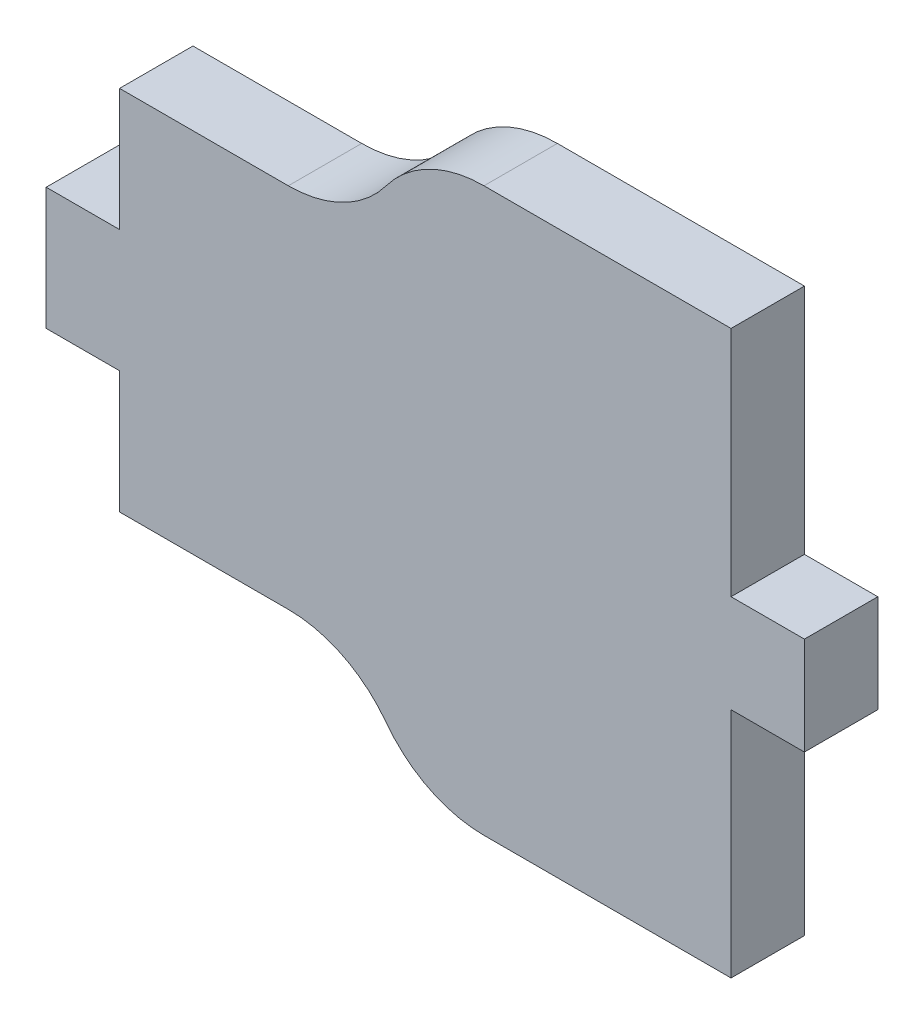
ISO-10303-21;
HEADER;
FILE_DESCRIPTION(('STEP AP214'),'2;1');
FILE_NAME('part.step','',(''),(''),'','','');
FILE_SCHEMA(('AUTOMOTIVE_DESIGN { 1 0 10303 214 1 1 1 1 }'));
ENDSEC;
DATA;
#1=APPLICATION_CONTEXT('core data for automotive mechanical design processes');
#2=APPLICATION_PROTOCOL_DEFINITION('international standard','automotive_design',2000,#1);
#3=PRODUCT_CONTEXT('',#1,'mechanical');
#4=PRODUCT('Part','Part','',(#3));
#5=PRODUCT_RELATED_PRODUCT_CATEGORY('part','',(#4));
#6=PRODUCT_DEFINITION_FORMATION('','',#4);
#7=PRODUCT_DEFINITION_CONTEXT('part definition',#1,'design');
#8=PRODUCT_DEFINITION('design','',#6,#7);
#9=PRODUCT_DEFINITION_SHAPE('','',#8);
#10=(LENGTH_UNIT() NAMED_UNIT(*) SI_UNIT(.MILLI.,.METRE.));
#11=(NAMED_UNIT(*) PLANE_ANGLE_UNIT() SI_UNIT($,.RADIAN.));
#12=(NAMED_UNIT(*) SI_UNIT($,.STERADIAN.) SOLID_ANGLE_UNIT());
#13=UNCERTAINTY_MEASURE_WITH_UNIT(LENGTH_MEASURE(1.E-05),#10,'distance_accuracy_value','');
#14=(GEOMETRIC_REPRESENTATION_CONTEXT(3) GLOBAL_UNCERTAINTY_ASSIGNED_CONTEXT((#13)) GLOBAL_UNIT_ASSIGNED_CONTEXT((#10,
#11,#12)) REPRESENTATION_CONTEXT('',''));
#15=CARTESIAN_POINT('',(0.,0.,0.));
#16=DIRECTION('',(0.,0.,1.));
#17=DIRECTION('',(1.,0.,0.));
#18=AXIS2_PLACEMENT_3D('',#15,#16,#17);
#19=CARTESIAN_POINT('',(27.7329421395879,18.0666881044929,6.));
#20=DIRECTION('',(-1.,0.,0.));
#21=DIRECTION('',(0.,-1.,0.));
#22=AXIS2_PLACEMENT_3D('',#19,#20,#21);
#23=PLANE('',#22);
#24=DIRECTION('',(0.,0.,1.));
#25=VECTOR('',#24,1.);
#26=CARTESIAN_POINT('',(27.7329421395879,7.06668810449294,0.));
#27=LINE('',#26,#25);
#28=CARTESIAN_POINT('',(27.7329421395879,7.06668810449294,0.));
#29=VERTEX_POINT('',#28);
#30=CARTESIAN_POINT('',(27.7329421395879,7.06668810449294,6.));
#31=VERTEX_POINT('',#30);
#32=EDGE_CURVE('E513',#29,#31,#27,.T.);
#33=ORIENTED_EDGE('',*,*,#32,.F.);
#34=DIRECTION('',(0.,1.,0.));
#35=VECTOR('',#34,1.);
#36=CARTESIAN_POINT('',(27.7329421395879,18.0666881044929,0.));
#37=LINE('',#36,#35);
#38=CARTESIAN_POINT('',(27.7329421395879,26.0666881044929,0.));
#39=VERTEX_POINT('',#38);
#40=EDGE_CURVE('E184',#29,#39,#37,.T.);
#41=ORIENTED_EDGE('',*,*,#40,.T.);
#42=DIRECTION('',(0.,0.,1.));
#43=VECTOR('',#42,1.);
#44=CARTESIAN_POINT('',(27.7329421395879,26.0666881044929,0.));
#45=LINE('',#44,#43);
#46=CARTESIAN_POINT('',(27.7329421395879,26.0666881044929,6.));
#47=VERTEX_POINT('',#46);
#48=EDGE_CURVE('E271',#39,#47,#45,.T.);
#49=ORIENTED_EDGE('',*,*,#48,.T.);
#50=DIRECTION('',(0.,1.,0.));
#51=VECTOR('',#50,1.);
#52=CARTESIAN_POINT('',(27.7329421395879,18.0666881044929,6.));
#53=LINE('',#52,#51);
#54=EDGE_CURVE('E265',#31,#47,#53,.T.);
#55=ORIENTED_EDGE('',*,*,#54,.F.);
#56=EDGE_LOOP('',(#33,#41,#49,#55));
#57=FACE_BOUND('',#56,.T.);
#58=ADVANCED_FACE('F33',(#57),#23,.F.);
#59=CARTESIAN_POINT('',(-22.2670578604121,18.0666881044929,6.));
#60=DIRECTION('',(1.,0.,0.));
#61=DIRECTION('',(0.,1.,0.));
#62=AXIS2_PLACEMENT_3D('',#59,#60,#61);
#63=PLANE('',#62);
#64=DIRECTION('',(0.,0.,1.));
#65=VECTOR('',#64,1.);
#66=CARTESIAN_POINT('',(-22.2670578604121,-1.93331189550706,0.));
#67=LINE('',#66,#65);
#68=CARTESIAN_POINT('',(-22.2670578604121,-1.93331189550706,0.));
#69=VERTEX_POINT('',#68);
#70=CARTESIAN_POINT('',(-22.2670578604121,-1.93331189550706,6.));
#71=VERTEX_POINT('',#70);
#72=EDGE_CURVE('E324',#69,#71,#67,.T.);
#73=ORIENTED_EDGE('',*,*,#72,.F.);
#74=DIRECTION('',(0.,-1.,0.));
#75=VECTOR('',#74,1.);
#76=CARTESIAN_POINT('',(-22.2670578604121,18.0666881044929,0.));
#77=LINE('',#76,#75);
#78=CARTESIAN_POINT('',(-22.2670578604121,-11.9333118955071,0.));
#79=VERTEX_POINT('',#78);
#80=EDGE_CURVE('E222',#69,#79,#77,.T.);
#81=ORIENTED_EDGE('',*,*,#80,.T.);
#82=DIRECTION('',(0.,0.,-1.));
#83=VECTOR('',#82,1.);
#84=CARTESIAN_POINT('',(-22.2670578604121,-11.9333118955071,6.));
#85=LINE('',#84,#83);
#86=CARTESIAN_POINT('',(-22.2670578604121,-11.9333118955071,6.));
#87=VERTEX_POINT('',#86);
#88=EDGE_CURVE('E258',#87,#79,#85,.T.);
#89=ORIENTED_EDGE('',*,*,#88,.F.);
#90=DIRECTION('',(0.,-1.,0.));
#91=VECTOR('',#90,1.);
#92=CARTESIAN_POINT('',(-22.2670578604121,18.0666881044929,6.));
#93=LINE('',#92,#91);
#94=EDGE_CURVE('E186',#71,#87,#93,.T.);
#95=ORIENTED_EDGE('',*,*,#94,.F.);
#96=EDGE_LOOP('',(#73,#81,#89,#95));
#97=FACE_BOUND('',#96,.T.);
#98=ADVANCED_FACE('F294',(#97),#63,.F.);
#99=CARTESIAN_POINT('',(-22.2670578604121,18.0666881044929,6.));
#100=DIRECTION('',(0.,-1.,0.));
#101=DIRECTION('',(0.,0.,-1.));
#102=AXIS2_PLACEMENT_3D('',#99,#100,#101);
#103=PLANE('',#102);
#104=DIRECTION('',(-1.,0.,0.));
#105=VECTOR('',#104,1.);
#106=CARTESIAN_POINT('',(-22.2670578604121,18.0666881044929,6.));
#107=LINE('',#106,#105);
#108=CARTESIAN_POINT('',(-8.46909888927936,18.0666881044929,6.));
#109=VERTEX_POINT('',#108);
#110=CARTESIAN_POINT('',(-22.2670578604121,18.0666881044929,6.));
#111=VERTEX_POINT('',#110);
#112=EDGE_CURVE('E209',#109,#111,#107,.T.);
#113=ORIENTED_EDGE('',*,*,#112,.F.);
#114=DIRECTION('',(0.,0.,1.));
#115=VECTOR('',#114,1.);
#116=CARTESIAN_POINT('',(-8.46909888927936,18.0666881044929,6.));
#117=LINE('',#116,#115);
#118=CARTESIAN_POINT('',(-8.46909888927936,18.0666881044929,0.));
#119=VERTEX_POINT('',#118);
#120=EDGE_CURVE('E213',#109,#119,#117,.F.);
#121=ORIENTED_EDGE('',*,*,#120,.T.);
#122=DIRECTION('',(-1.,0.,0.));
#123=VECTOR('',#122,1.);
#124=CARTESIAN_POINT('',(-22.2670578604121,18.0666881044929,0.));
#125=LINE('',#124,#123);
#126=CARTESIAN_POINT('',(-22.2670578604121,18.0666881044929,0.));
#127=VERTEX_POINT('',#126);
#128=EDGE_CURVE('E183',#119,#127,#125,.T.);
#129=ORIENTED_EDGE('',*,*,#128,.T.);
#130=DIRECTION('',(0.,0.,-1.));
#131=VECTOR('',#130,1.);
#132=CARTESIAN_POINT('',(-22.2670578604121,18.0666881044929,6.));
#133=LINE('',#132,#131);
#134=EDGE_CURVE('E203',#111,#127,#133,.T.);
#135=ORIENTED_EDGE('',*,*,#134,.F.);
#136=EDGE_LOOP('',(#113,#121,#129,#135));
#137=FACE_BOUND('',#136,.T.);
#138=ADVANCED_FACE('F376',(#137),#103,.F.);
#139=CARTESIAN_POINT('',(-22.2670578604121,8.06668810449294,0.));
#140=VERTEX_POINT('',#139);
#141=EDGE_CURVE('E225',#127,#140,#77,.T.);
#142=ORIENTED_EDGE('',*,*,#141,.T.);
#143=DIRECTION('',(0.,0.,1.));
#144=VECTOR('',#143,1.);
#145=CARTESIAN_POINT('',(-22.2670578604121,8.06668810449294,0.));
#146=LINE('',#145,#144);
#147=CARTESIAN_POINT('',(-22.2670578604121,8.06668810449294,6.));
#148=VERTEX_POINT('',#147);
#149=EDGE_CURVE('E319',#140,#148,#146,.T.);
#150=ORIENTED_EDGE('',*,*,#149,.T.);
#151=EDGE_CURVE('E266',#111,#148,#93,.T.);
#152=ORIENTED_EDGE('',*,*,#151,.F.);
#153=ORIENTED_EDGE('',*,*,#134,.T.);
#154=EDGE_LOOP('',(#142,#150,#152,#153));
#155=FACE_BOUND('',#154,.T.);
#156=ADVANCED_FACE('F301',(#155),#63,.F.);
#157=CARTESIAN_POINT('',(-22.2670578604121,-11.9333118955071,6.));
#158=DIRECTION('',(0.,1.,0.));
#159=DIRECTION('',(0.,0.,1.));
#160=AXIS2_PLACEMENT_3D('',#157,#158,#159);
#161=PLANE('',#160);
#162=DIRECTION('',(1.,0.,0.));
#163=VECTOR('',#162,1.);
#164=CARTESIAN_POINT('',(-22.2670578604121,-11.9333118955071,0.));
#165=LINE('',#164,#163);
#166=CARTESIAN_POINT('',(-8.46909888927935,-11.9333118955071,0.));
#167=VERTEX_POINT('',#166);
#168=EDGE_CURVE('E188',#79,#167,#165,.T.);
#169=ORIENTED_EDGE('',*,*,#168,.T.);
#170=DIRECTION('',(0.,0.,-1.));
#171=VECTOR('',#170,1.);
#172=CARTESIAN_POINT('',(-8.46909888927935,-11.9333118955071,6.));
#173=LINE('',#172,#171);
#174=CARTESIAN_POINT('',(-8.46909888927935,-11.9333118955071,6.));
#175=VERTEX_POINT('',#174);
#176=EDGE_CURVE('E231',#167,#175,#173,.F.);
#177=ORIENTED_EDGE('',*,*,#176,.T.);
#178=DIRECTION('',(1.,0.,0.));
#179=VECTOR('',#178,1.);
#180=CARTESIAN_POINT('',(-22.2670578604121,-11.9333118955071,6.));
#181=LINE('',#180,#179);
#182=EDGE_CURVE('E262',#87,#175,#181,.T.);
#183=ORIENTED_EDGE('',*,*,#182,.F.);
#184=ORIENTED_EDGE('',*,*,#88,.T.);
#185=EDGE_LOOP('',(#169,#177,#183,#184));
#186=FACE_BOUND('',#185,.T.);
#187=ADVANCED_FACE('F292',(#186),#161,.F.);
#188=CARTESIAN_POINT('',(27.7329421395879,-19.9333118955071,0.));
#189=VERTEX_POINT('',#188);
#190=CARTESIAN_POINT('',(27.7329421395879,-0.933311895507053,0.));
#191=VERTEX_POINT('',#190);
#192=EDGE_CURVE('E173',#189,#191,#37,.T.);
#193=ORIENTED_EDGE('',*,*,#192,.T.);
#194=DIRECTION('',(0.,0.,1.));
#195=VECTOR('',#194,1.);
#196=CARTESIAN_POINT('',(27.7329421395879,-0.933311895507053,0.));
#197=LINE('',#196,#195);
#198=CARTESIAN_POINT('',(27.7329421395879,-0.933311895507053,6.));
#199=VERTEX_POINT('',#198);
#200=EDGE_CURVE('E157',#191,#199,#197,.T.);
#201=ORIENTED_EDGE('',*,*,#200,.T.);
#202=CARTESIAN_POINT('',(27.7329421395879,-19.9333118955071,6.));
#203=VERTEX_POINT('',#202);
#204=EDGE_CURVE('E212',#203,#199,#53,.T.);
#205=ORIENTED_EDGE('',*,*,#204,.F.);
#206=DIRECTION('',(0.,0.,1.));
#207=VECTOR('',#206,1.);
#208=CARTESIAN_POINT('',(27.7329421395879,-19.9333118955071,0.));
#209=LINE('',#208,#207);
#210=EDGE_CURVE('E182',#189,#203,#209,.T.);
#211=ORIENTED_EDGE('',*,*,#210,.F.);
#212=EDGE_LOOP('',(#193,#201,#205,#211));
#213=FACE_BOUND('',#212,.T.);
#214=ADVANCED_FACE('F180',(#213),#23,.F.);
#215=CARTESIAN_POINT('',(0.,0.,6.));
#216=DIRECTION('',(0.,0.,1.));
#217=DIRECTION('',(1.,0.,0.));
#218=AXIS2_PLACEMENT_3D('',#215,#216,#217);
#219=PLANE('',#218);
#220=ORIENTED_EDGE('',*,*,#182,.T.);
#221=CARTESIAN_POINT('',(-8.46909888927935,-21.9333118955071,6.));
#222=DIRECTION('',(0.,0.,1.));
#223=DIRECTION('',(1.,0.,0.));
#224=AXIS2_PLACEMENT_3D('',#221,#222,#223);
#225=CIRCLE('',#224,10.);
#226=CARTESIAN_POINT('',(-0.469098889279351,-15.9333118955071,6.));
#227=VERTEX_POINT('',#226);
#228=EDGE_CURVE('E42',#175,#227,#225,.F.);
#229=ORIENTED_EDGE('',*,*,#228,.T.);
#230=CARTESIAN_POINT('',(7.53090111072065,-9.93331189550705,6.));
#231=DIRECTION('',(0.,0.,1.));
#232=DIRECTION('',(1.,0.,0.));
#233=AXIS2_PLACEMENT_3D('',#230,#231,#232);
#234=CIRCLE('',#233,10.);
#235=CARTESIAN_POINT('',(7.53090111072065,-19.9333118955071,6.));
#236=VERTEX_POINT('',#235);
#237=EDGE_CURVE('E232',#227,#236,#234,.T.);
#238=ORIENTED_EDGE('',*,*,#237,.T.);
#239=DIRECTION('',(1.,0.,0.));
#240=VECTOR('',#239,1.);
#241=CARTESIAN_POINT('',(-2.26705786041206,-19.9333118955071,6.));
#242=LINE('',#241,#240);
#243=EDGE_CURVE('E327',#236,#203,#242,.T.);
#244=ORIENTED_EDGE('',*,*,#243,.T.);
#245=ORIENTED_EDGE('',*,*,#204,.T.);
#246=DIRECTION('',(1.,0.,0.));
#247=VECTOR('',#246,1.);
#248=CARTESIAN_POINT('',(27.7329421395879,-0.933311895507053,6.));
#249=LINE('',#248,#247);
#250=CARTESIAN_POINT('',(33.7329421395879,-0.933311895507053,6.));
#251=VERTEX_POINT('',#250);
#252=EDGE_CURVE('E50',#199,#251,#249,.T.);
#253=ORIENTED_EDGE('',*,*,#252,.T.);
#254=DIRECTION('',(0.,1.,0.));
#255=VECTOR('',#254,1.);
#256=CARTESIAN_POINT('',(33.7329421395879,7.06668810449294,6.));
#257=LINE('',#256,#255);
#258=CARTESIAN_POINT('',(33.7329421395879,7.06668810449294,6.));
#259=VERTEX_POINT('',#258);
#260=EDGE_CURVE('E499',#251,#259,#257,.T.);
#261=ORIENTED_EDGE('',*,*,#260,.T.);
#262=DIRECTION('',(-1.,0.,0.));
#263=VECTOR('',#262,1.);
#264=CARTESIAN_POINT('',(27.7329421395879,7.06668810449294,6.));
#265=LINE('',#264,#263);
#266=EDGE_CURVE('E178',#259,#31,#265,.T.);
#267=ORIENTED_EDGE('',*,*,#266,.T.);
#268=ORIENTED_EDGE('',*,*,#54,.T.);
#269=DIRECTION('',(-1.,0.,0.));
#270=VECTOR('',#269,1.);
#271=CARTESIAN_POINT('',(-2.26705786041207,26.0666881044929,6.));
#272=LINE('',#271,#270);
#273=CARTESIAN_POINT('',(7.53090111072065,26.0666881044929,6.));
#274=VERTEX_POINT('',#273);
#275=EDGE_CURVE('E341',#47,#274,#272,.T.);
#276=ORIENTED_EDGE('',*,*,#275,.T.);
#277=CARTESIAN_POINT('',(7.53090111072065,16.0666881044929,6.));
#278=DIRECTION('',(0.,0.,1.));
#279=DIRECTION('',(1.,0.,0.));
#280=AXIS2_PLACEMENT_3D('',#277,#278,#279);
#281=CIRCLE('',#280,10.);
#282=CARTESIAN_POINT('',(-0.469098889279354,22.0666881044929,6.));
#283=VERTEX_POINT('',#282);
#284=EDGE_CURVE('E248',#274,#283,#281,.T.);
#285=ORIENTED_EDGE('',*,*,#284,.T.);
#286=CARTESIAN_POINT('',(-8.46909888927936,28.0666881044929,6.));
#287=DIRECTION('',(0.,0.,1.));
#288=DIRECTION('',(1.,0.,0.));
#289=AXIS2_PLACEMENT_3D('',#286,#287,#288);
#290=CIRCLE('',#289,10.);
#291=EDGE_CURVE('E356',#283,#109,#290,.F.);
#292=ORIENTED_EDGE('',*,*,#291,.T.);
#293=ORIENTED_EDGE('',*,*,#112,.T.);
#294=ORIENTED_EDGE('',*,*,#151,.T.);
#295=DIRECTION('',(-1.,0.,0.));
#296=VECTOR('',#295,1.);
#297=CARTESIAN_POINT('',(-22.2670578604121,8.06668810449294,6.));
#298=LINE('',#297,#296);
#299=CARTESIAN_POINT('',(-28.2670578604121,8.06668810449294,6.));
#300=VERTEX_POINT('',#299);
#301=EDGE_CURVE('E58',#148,#300,#298,.T.);
#302=ORIENTED_EDGE('',*,*,#301,.T.);
#303=DIRECTION('',(0.,-1.,0.));
#304=VECTOR('',#303,1.);
#305=CARTESIAN_POINT('',(-28.2670578604121,8.06668810449294,6.));
#306=LINE('',#305,#304);
#307=CARTESIAN_POINT('',(-28.2670578604121,-1.93331189550706,6.));
#308=VERTEX_POINT('',#307);
#309=EDGE_CURVE('E316',#300,#308,#306,.T.);
#310=ORIENTED_EDGE('',*,*,#309,.T.);
#311=DIRECTION('',(1.,0.,0.));
#312=VECTOR('',#311,1.);
#313=CARTESIAN_POINT('',(-22.2670578604121,-1.93331189550706,6.));
#314=LINE('',#313,#312);
#315=EDGE_CURVE('E284',#308,#71,#314,.T.);
#316=ORIENTED_EDGE('',*,*,#315,.T.);
#317=ORIENTED_EDGE('',*,*,#94,.T.);
#318=EDGE_LOOP('',(#220,#229,#238,#244,#245,#253,#261,#267,#268,#276,#285,#292,#293,#294,#302,
#310,#316,#317));
#319=FACE_BOUND('',#318,.T.);
#320=ADVANCED_FACE('F281',(#319),#219,.T.);
#321=CARTESIAN_POINT('',(0.,0.,0.));
#322=DIRECTION('',(0.,0.,1.));
#323=DIRECTION('',(1.,0.,0.));
#324=AXIS2_PLACEMENT_3D('',#321,#322,#323);
#325=PLANE('',#324);
#326=DIRECTION('',(1.,0.,0.));
#327=VECTOR('',#326,1.);
#328=CARTESIAN_POINT('',(-2.26705786041206,-19.9333118955071,0.));
#329=LINE('',#328,#327);
#330=CARTESIAN_POINT('',(7.53090111072065,-19.9333118955071,0.));
#331=VERTEX_POINT('',#330);
#332=EDGE_CURVE('E337',#331,#189,#329,.T.);
#333=ORIENTED_EDGE('',*,*,#332,.F.);
#334=CARTESIAN_POINT('',(7.53090111072065,-9.93331189550705,0.));
#335=DIRECTION('',(0.,0.,1.));
#336=DIRECTION('',(1.,0.,0.));
#337=AXIS2_PLACEMENT_3D('',#334,#335,#336);
#338=CIRCLE('',#337,10.);
#339=CARTESIAN_POINT('',(-0.469098889279351,-15.9333118955071,0.));
#340=VERTEX_POINT('',#339);
#341=EDGE_CURVE('E244',#331,#340,#338,.F.);
#342=ORIENTED_EDGE('',*,*,#341,.T.);
#343=CARTESIAN_POINT('',(-8.46909888927935,-21.9333118955071,0.));
#344=DIRECTION('',(0.,0.,1.));
#345=DIRECTION('',(1.,0.,0.));
#346=AXIS2_PLACEMENT_3D('',#343,#344,#345);
#347=CIRCLE('',#346,10.);
#348=EDGE_CURVE('E11',#340,#167,#347,.T.);
#349=ORIENTED_EDGE('',*,*,#348,.T.);
#350=ORIENTED_EDGE('',*,*,#168,.F.);
#351=ORIENTED_EDGE('',*,*,#80,.F.);
#352=DIRECTION('',(1.,0.,0.));
#353=VECTOR('',#352,1.);
#354=CARTESIAN_POINT('',(-22.2670578604121,-1.93331189550706,0.));
#355=LINE('',#354,#353);
#356=CARTESIAN_POINT('',(-28.2670578604121,-1.93331189550706,0.));
#357=VERTEX_POINT('',#356);
#358=EDGE_CURVE('E314',#357,#69,#355,.T.);
#359=ORIENTED_EDGE('',*,*,#358,.F.);
#360=DIRECTION('',(0.,-1.,0.));
#361=VECTOR('',#360,1.);
#362=CARTESIAN_POINT('',(-28.2670578604121,8.06668810449294,0.));
#363=LINE('',#362,#361);
#364=CARTESIAN_POINT('',(-28.2670578604121,8.06668810449294,0.));
#365=VERTEX_POINT('',#364);
#366=EDGE_CURVE('E312',#365,#357,#363,.T.);
#367=ORIENTED_EDGE('',*,*,#366,.F.);
#368=DIRECTION('',(-1.,0.,0.));
#369=VECTOR('',#368,1.);
#370=CARTESIAN_POINT('',(-22.2670578604121,8.06668810449294,0.));
#371=LINE('',#370,#369);
#372=EDGE_CURVE('E309',#140,#365,#371,.T.);
#373=ORIENTED_EDGE('',*,*,#372,.F.);
#374=ORIENTED_EDGE('',*,*,#141,.F.);
#375=ORIENTED_EDGE('',*,*,#128,.F.);
#376=CARTESIAN_POINT('',(-8.46909888927936,28.0666881044929,0.));
#377=DIRECTION('',(0.,0.,1.));
#378=DIRECTION('',(1.,0.,0.));
#379=AXIS2_PLACEMENT_3D('',#376,#377,#378);
#380=CIRCLE('',#379,10.);
#381=CARTESIAN_POINT('',(-0.469098889279354,22.0666881044929,0.));
#382=VERTEX_POINT('',#381);
#383=EDGE_CURVE('E358',#119,#382,#380,.T.);
#384=ORIENTED_EDGE('',*,*,#383,.T.);
#385=CARTESIAN_POINT('',(7.53090111072065,16.0666881044929,0.));
#386=DIRECTION('',(0.,0.,1.));
#387=DIRECTION('',(1.,0.,0.));
#388=AXIS2_PLACEMENT_3D('',#385,#386,#387);
#389=CIRCLE('',#388,10.);
#390=CARTESIAN_POINT('',(7.53090111072065,26.0666881044929,0.));
#391=VERTEX_POINT('',#390);
#392=EDGE_CURVE('E236',#382,#391,#389,.F.);
#393=ORIENTED_EDGE('',*,*,#392,.T.);
#394=DIRECTION('',(-1.,0.,0.));
#395=VECTOR('',#394,1.);
#396=CARTESIAN_POINT('',(-2.26705786041207,26.0666881044929,0.));
#397=LINE('',#396,#395);
#398=EDGE_CURVE('E342',#39,#391,#397,.T.);
#399=ORIENTED_EDGE('',*,*,#398,.F.);
#400=ORIENTED_EDGE('',*,*,#40,.F.);
#401=DIRECTION('',(-1.,0.,0.));
#402=VECTOR('',#401,1.);
#403=CARTESIAN_POINT('',(27.7329421395879,7.06668810449294,0.));
#404=LINE('',#403,#402);
#405=CARTESIAN_POINT('',(33.7329421395879,7.06668810449294,0.));
#406=VERTEX_POINT('',#405);
#407=EDGE_CURVE('E166',#406,#29,#404,.T.);
#408=ORIENTED_EDGE('',*,*,#407,.F.);
#409=DIRECTION('',(0.,1.,0.));
#410=VECTOR('',#409,1.);
#411=CARTESIAN_POINT('',(33.7329421395879,7.06668810449294,0.));
#412=LINE('',#411,#410);
#413=CARTESIAN_POINT('',(33.7329421395879,-0.933311895507053,0.));
#414=VERTEX_POINT('',#413);
#415=EDGE_CURVE('E177',#414,#406,#412,.T.);
#416=ORIENTED_EDGE('',*,*,#415,.F.);
#417=DIRECTION('',(1.,0.,0.));
#418=VECTOR('',#417,1.);
#419=CARTESIAN_POINT('',(27.7329421395879,-0.933311895507053,0.));
#420=LINE('',#419,#418);
#421=EDGE_CURVE('E160',#191,#414,#420,.T.);
#422=ORIENTED_EDGE('',*,*,#421,.F.);
#423=ORIENTED_EDGE('',*,*,#192,.F.);
#424=EDGE_LOOP('',(#333,#342,#349,#350,#351,#359,#367,#373,#374,#375,#384,#393,#399,#400,#408,
#416,#422,#423));
#425=FACE_BOUND('',#424,.T.);
#426=ADVANCED_FACE('F172',(#425),#325,.F.);
#427=CARTESIAN_POINT('',(-2.26705786041207,26.0666881044929,0.));
#428=DIRECTION('',(0.,1.,0.));
#429=DIRECTION('',(0.,0.,1.));
#430=AXIS2_PLACEMENT_3D('',#427,#428,#429);
#431=PLANE('',#430);
#432=ORIENTED_EDGE('',*,*,#398,.T.);
#433=DIRECTION('',(0.,0.,-1.));
#434=VECTOR('',#433,1.);
#435=CARTESIAN_POINT('',(7.53090111072065,26.0666881044929,6.));
#436=LINE('',#435,#434);
#437=EDGE_CURVE('E253',#391,#274,#436,.F.);
#438=ORIENTED_EDGE('',*,*,#437,.T.);
#439=ORIENTED_EDGE('',*,*,#275,.F.);
#440=ORIENTED_EDGE('',*,*,#48,.F.);
#441=EDGE_LOOP('',(#432,#438,#439,#440));
#442=FACE_BOUND('',#441,.T.);
#443=ADVANCED_FACE('F349',(#442),#431,.T.);
#444=CARTESIAN_POINT('',(-2.26705786041206,-19.9333118955071,0.));
#445=DIRECTION('',(0.,-1.,0.));
#446=DIRECTION('',(1.,0.,0.));
#447=AXIS2_PLACEMENT_3D('',#444,#445,#446);
#448=PLANE('',#447);
#449=ORIENTED_EDGE('',*,*,#243,.F.);
#450=DIRECTION('',(0.,0.,1.));
#451=VECTOR('',#450,1.);
#452=CARTESIAN_POINT('',(7.53090111072065,-19.9333118955071,0.));
#453=LINE('',#452,#451);
#454=EDGE_CURVE('E235',#236,#331,#453,.F.);
#455=ORIENTED_EDGE('',*,*,#454,.T.);
#456=ORIENTED_EDGE('',*,*,#332,.T.);
#457=ORIENTED_EDGE('',*,*,#210,.T.);
#458=EDGE_LOOP('',(#449,#455,#456,#457));
#459=FACE_BOUND('',#458,.T.);
#460=ADVANCED_FACE('F392',(#459),#448,.T.);
#461=CARTESIAN_POINT('',(7.53090111072065,16.0666881044929,0.));
#462=DIRECTION('',(0.,0.,1.));
#463=DIRECTION('',(1.,0.,0.));
#464=AXIS2_PLACEMENT_3D('',#461,#462,#463);
#465=CYLINDRICAL_SURFACE('',#464,10.);
#466=ORIENTED_EDGE('',*,*,#392,.F.);
#467=DIRECTION('',(0.,0.,1.));
#468=VECTOR('',#467,1.);
#469=CARTESIAN_POINT('',(-0.469098889279354,22.0666881044929,0.));
#470=LINE('',#469,#468);
#471=EDGE_CURVE('E207',#382,#283,#470,.T.);
#472=ORIENTED_EDGE('',*,*,#471,.T.);
#473=ORIENTED_EDGE('',*,*,#284,.F.);
#474=ORIENTED_EDGE('',*,*,#437,.F.);
#475=EDGE_LOOP('',(#466,#472,#473,#474));
#476=FACE_BOUND('',#475,.T.);
#477=ADVANCED_FACE('F352',(#476),#465,.T.);
#478=CARTESIAN_POINT('',(7.53090111072065,-9.93331189550705,0.));
#479=DIRECTION('',(0.,0.,-1.));
#480=DIRECTION('',(-1.,0.,0.));
#481=AXIS2_PLACEMENT_3D('',#478,#479,#480);
#482=CYLINDRICAL_SURFACE('',#481,10.);
#483=ORIENTED_EDGE('',*,*,#237,.F.);
#484=DIRECTION('',(0.,0.,-1.));
#485=VECTOR('',#484,1.);
#486=CARTESIAN_POINT('',(-0.469098889279351,-15.9333118955071,0.));
#487=LINE('',#486,#485);
#488=EDGE_CURVE('E229',#227,#340,#487,.T.);
#489=ORIENTED_EDGE('',*,*,#488,.T.);
#490=ORIENTED_EDGE('',*,*,#341,.F.);
#491=ORIENTED_EDGE('',*,*,#454,.F.);
#492=EDGE_LOOP('',(#483,#489,#490,#491));
#493=FACE_BOUND('',#492,.T.);
#494=ADVANCED_FACE('F361',(#493),#482,.T.);
#495=CARTESIAN_POINT('',(-8.46909888927936,28.0666881044929,0.));
#496=DIRECTION('',(0.,0.,1.));
#497=DIRECTION('',(1.,0.,0.));
#498=AXIS2_PLACEMENT_3D('',#495,#496,#497);
#499=CYLINDRICAL_SURFACE('',#498,10.);
#500=ORIENTED_EDGE('',*,*,#383,.F.);
#501=ORIENTED_EDGE('',*,*,#120,.F.);
#502=ORIENTED_EDGE('',*,*,#291,.F.);
#503=ORIENTED_EDGE('',*,*,#471,.F.);
#504=EDGE_LOOP('',(#500,#501,#502,#503));
#505=FACE_BOUND('',#504,.T.);
#506=ADVANCED_FACE('F359',(#505),#499,.F.);
#507=CARTESIAN_POINT('',(-8.46909888927935,-21.9333118955071,0.));
#508=DIRECTION('',(0.,0.,-1.));
#509=DIRECTION('',(-1.,0.,0.));
#510=AXIS2_PLACEMENT_3D('',#507,#508,#509);
#511=CYLINDRICAL_SURFACE('',#510,10.);
#512=ORIENTED_EDGE('',*,*,#348,.F.);
#513=ORIENTED_EDGE('',*,*,#488,.F.);
#514=ORIENTED_EDGE('',*,*,#228,.F.);
#515=ORIENTED_EDGE('',*,*,#176,.F.);
#516=EDGE_LOOP('',(#512,#513,#514,#515));
#517=FACE_BOUND('',#516,.T.);
#518=ADVANCED_FACE('F35',(#517),#511,.F.);
#519=CARTESIAN_POINT('',(-22.2670578604121,-1.93331189550706,0.));
#520=DIRECTION('',(0.,-1.,0.));
#521=DIRECTION('',(1.,0.,0.));
#522=AXIS2_PLACEMENT_3D('',#519,#520,#521);
#523=PLANE('',#522);
#524=ORIENTED_EDGE('',*,*,#315,.F.);
#525=DIRECTION('',(0.,0.,1.));
#526=VECTOR('',#525,1.);
#527=CARTESIAN_POINT('',(-28.2670578604121,-1.93331189550706,0.));
#528=LINE('',#527,#526);
#529=EDGE_CURVE('E328',#357,#308,#528,.T.);
#530=ORIENTED_EDGE('',*,*,#529,.F.);
#531=ORIENTED_EDGE('',*,*,#358,.T.);
#532=ORIENTED_EDGE('',*,*,#72,.T.);
#533=EDGE_LOOP('',(#524,#530,#531,#532));
#534=FACE_BOUND('',#533,.T.);
#535=ADVANCED_FACE('F366',(#534),#523,.T.);
#536=CARTESIAN_POINT('',(-28.2670578604121,8.06668810449294,0.));
#537=DIRECTION('',(-1.,0.,0.));
#538=DIRECTION('',(0.,0.,1.));
#539=AXIS2_PLACEMENT_3D('',#536,#537,#538);
#540=PLANE('',#539);
#541=ORIENTED_EDGE('',*,*,#309,.F.);
#542=DIRECTION('',(0.,0.,1.));
#543=VECTOR('',#542,1.);
#544=CARTESIAN_POINT('',(-28.2670578604121,8.06668810449294,0.));
#545=LINE('',#544,#543);
#546=EDGE_CURVE('E334',#365,#300,#545,.T.);
#547=ORIENTED_EDGE('',*,*,#546,.F.);
#548=ORIENTED_EDGE('',*,*,#366,.T.);
#549=ORIENTED_EDGE('',*,*,#529,.T.);
#550=EDGE_LOOP('',(#541,#547,#548,#549));
#551=FACE_BOUND('',#550,.T.);
#552=ADVANCED_FACE('F449',(#551),#540,.T.);
#553=CARTESIAN_POINT('',(-22.2670578604121,8.06668810449294,0.));
#554=DIRECTION('',(0.,1.,0.));
#555=DIRECTION('',(0.,0.,1.));
#556=AXIS2_PLACEMENT_3D('',#553,#554,#555);
#557=PLANE('',#556);
#558=ORIENTED_EDGE('',*,*,#301,.F.);
#559=ORIENTED_EDGE('',*,*,#149,.F.);
#560=ORIENTED_EDGE('',*,*,#372,.T.);
#561=ORIENTED_EDGE('',*,*,#546,.T.);
#562=EDGE_LOOP('',(#558,#559,#560,#561));
#563=FACE_BOUND('',#562,.T.);
#564=ADVANCED_FACE('F404',(#563),#557,.T.);
#565=CARTESIAN_POINT('',(27.7329421395879,7.06668810449294,0.));
#566=DIRECTION('',(0.,1.,0.));
#567=DIRECTION('',(0.,0.,1.));
#568=AXIS2_PLACEMENT_3D('',#565,#566,#567);
#569=PLANE('',#568);
#570=ORIENTED_EDGE('',*,*,#266,.F.);
#571=DIRECTION('',(0.,0.,1.));
#572=VECTOR('',#571,1.);
#573=CARTESIAN_POINT('',(33.7329421395879,7.06668810449294,0.));
#574=LINE('',#573,#572);
#575=EDGE_CURVE('E500',#406,#259,#574,.T.);
#576=ORIENTED_EDGE('',*,*,#575,.F.);
#577=ORIENTED_EDGE('',*,*,#407,.T.);
#578=ORIENTED_EDGE('',*,*,#32,.T.);
#579=EDGE_LOOP('',(#570,#576,#577,#578));
#580=FACE_BOUND('',#579,.T.);
#581=ADVANCED_FACE('F467',(#580),#569,.T.);
#582=CARTESIAN_POINT('',(33.7329421395879,7.06668810449294,0.));
#583=DIRECTION('',(1.,0.,0.));
#584=DIRECTION('',(0.,1.,0.));
#585=AXIS2_PLACEMENT_3D('',#582,#583,#584);
#586=PLANE('',#585);
#587=ORIENTED_EDGE('',*,*,#260,.F.);
#588=DIRECTION('',(0.,0.,1.));
#589=VECTOR('',#588,1.);
#590=CARTESIAN_POINT('',(33.7329421395879,-0.933311895507053,0.));
#591=LINE('',#590,#589);
#592=EDGE_CURVE('E165',#414,#251,#591,.T.);
#593=ORIENTED_EDGE('',*,*,#592,.F.);
#594=ORIENTED_EDGE('',*,*,#415,.T.);
#595=ORIENTED_EDGE('',*,*,#575,.T.);
#596=EDGE_LOOP('',(#587,#593,#594,#595));
#597=FACE_BOUND('',#596,.T.);
#598=ADVANCED_FACE('F475',(#597),#586,.T.);
#599=CARTESIAN_POINT('',(27.7329421395879,-0.933311895507053,0.));
#600=DIRECTION('',(0.,-1.,0.));
#601=DIRECTION('',(0.,0.,-1.));
#602=AXIS2_PLACEMENT_3D('',#599,#600,#601);
#603=PLANE('',#602);
#604=ORIENTED_EDGE('',*,*,#252,.F.);
#605=ORIENTED_EDGE('',*,*,#200,.F.);
#606=ORIENTED_EDGE('',*,*,#421,.T.);
#607=ORIENTED_EDGE('',*,*,#592,.T.);
#608=EDGE_LOOP('',(#604,#605,#606,#607));
#609=FACE_BOUND('',#608,.T.);
#610=ADVANCED_FACE('F159',(#609),#603,.T.);
#611=CLOSED_SHELL('',(#58,#98,#138,#156,#187,#214,#320,#426,#443,#460,#477,#494,#506,#518,#535,
#552,#564,#581,#598,#610));
#612=MANIFOLD_SOLID_BREP('B2',#611);
#613=ADVANCED_BREP_SHAPE_REPRESENTATION('',(#18,#612),#14);
#614=SHAPE_DEFINITION_REPRESENTATION(#9,#613);
ENDSEC;
END-ISO-10303-21;
